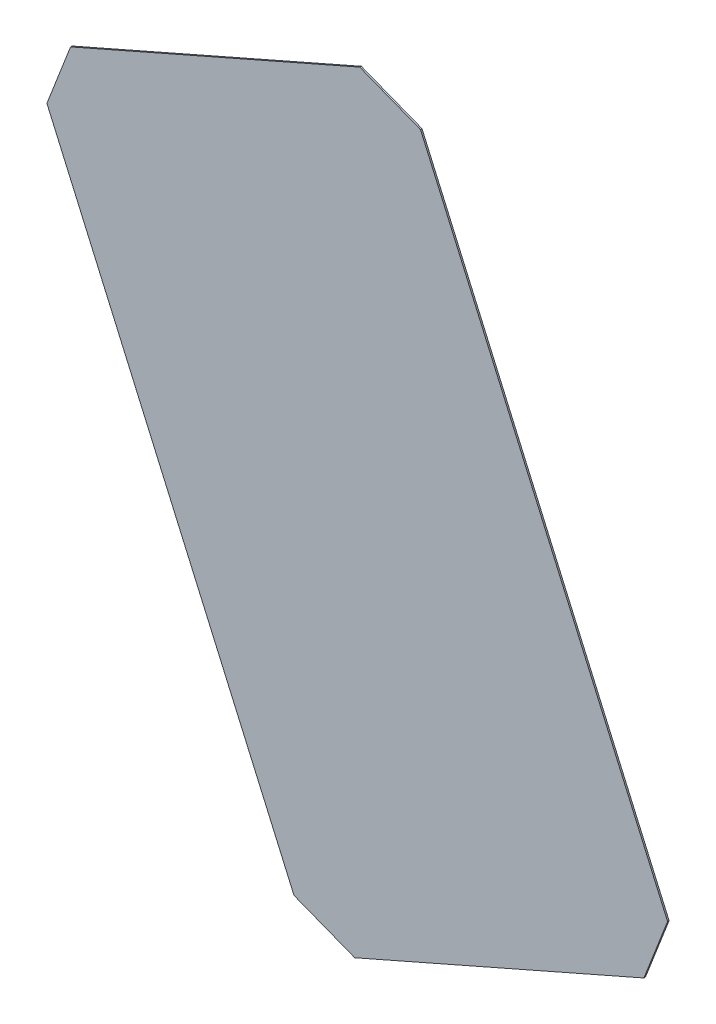
ISO-10303-21;
HEADER;
FILE_DESCRIPTION(('STEP AP214'),'2;1');
FILE_NAME('part.step','',(''),(''),'','','');
FILE_SCHEMA(('AUTOMOTIVE_DESIGN { 1 0 10303 214 1 1 1 1 }'));
ENDSEC;
DATA;
#1=APPLICATION_CONTEXT('core data for automotive mechanical design processes');
#2=APPLICATION_PROTOCOL_DEFINITION('international standard','automotive_design',2000,#1);
#3=PRODUCT_CONTEXT('',#1,'mechanical');
#4=PRODUCT('Part','Part','',(#3));
#5=PRODUCT_RELATED_PRODUCT_CATEGORY('part','',(#4));
#6=PRODUCT_DEFINITION_FORMATION('','',#4);
#7=PRODUCT_DEFINITION_CONTEXT('part definition',#1,'design');
#8=PRODUCT_DEFINITION('design','',#6,#7);
#9=PRODUCT_DEFINITION_SHAPE('','',#8);
#10=(LENGTH_UNIT() NAMED_UNIT(*) SI_UNIT(.MILLI.,.METRE.));
#11=(NAMED_UNIT(*) PLANE_ANGLE_UNIT() SI_UNIT($,.RADIAN.));
#12=(NAMED_UNIT(*) SI_UNIT($,.STERADIAN.) SOLID_ANGLE_UNIT());
#13=UNCERTAINTY_MEASURE_WITH_UNIT(LENGTH_MEASURE(1.E-05),#10,'distance_accuracy_value','');
#14=(GEOMETRIC_REPRESENTATION_CONTEXT(3) GLOBAL_UNCERTAINTY_ASSIGNED_CONTEXT((#13)) GLOBAL_UNIT_ASSIGNED_CONTEXT((#10,
#11,#12)) REPRESENTATION_CONTEXT('',''));
#15=CARTESIAN_POINT('',(0.,0.,0.));
#16=DIRECTION('',(0.,0.,1.));
#17=DIRECTION('',(1.,0.,0.));
#18=AXIS2_PLACEMENT_3D('',#15,#16,#17);
#19=CARTESIAN_POINT('',(-104.737676006849,451.856937350115,1.));
#20=DIRECTION('',(0.931814726160136,-0.362934313769187,0.));
#21=DIRECTION('',(0.362934313769187,0.931814726160136,0.));
#22=AXIS2_PLACEMENT_3D('',#19,#20,#21);
#23=PLANE('',#22);
#24=DIRECTION('',(-0.362934313769187,-0.931814726160136,0.));
#25=VECTOR('',#24,1.);
#26=CARTESIAN_POINT('',(-104.737676006849,451.856937350115,0.));
#27=LINE('',#26,#25);
#28=CARTESIAN_POINT('',(-89.33967714336,491.390488050754,0.));
#29=VERTEX_POINT('',#28);
#30=CARTESIAN_POINT('',(-104.737676006849,451.856937350115,0.));
#31=VERTEX_POINT('',#30);
#32=EDGE_CURVE('E133',#29,#31,#27,.T.);
#33=ORIENTED_EDGE('',*,*,#32,.T.);
#34=DIRECTION('',(0.,0.,-1.));
#35=VECTOR('',#34,1.);
#36=CARTESIAN_POINT('',(-104.737676006849,451.856937350115,1.));
#37=LINE('',#36,#35);
#38=CARTESIAN_POINT('',(-104.737676006849,451.856937350115,1.));
#39=VERTEX_POINT('',#38);
#40=EDGE_CURVE('E11',#39,#31,#37,.T.);
#41=ORIENTED_EDGE('',*,*,#40,.F.);
#42=DIRECTION('',(-0.362934313769187,-0.931814726160136,0.));
#43=VECTOR('',#42,1.);
#44=CARTESIAN_POINT('',(-104.737676006849,451.856937350115,1.));
#45=LINE('',#44,#43);
#46=CARTESIAN_POINT('',(-89.33967714336,491.390488050754,1.));
#47=VERTEX_POINT('',#46);
#48=EDGE_CURVE('E147',#47,#39,#45,.T.);
#49=ORIENTED_EDGE('',*,*,#48,.F.);
#50=DIRECTION('',(0.,0.,-1.));
#51=VECTOR('',#50,1.);
#52=CARTESIAN_POINT('',(-89.33967714336,491.390488050754,1.));
#53=LINE('',#52,#51);
#54=EDGE_CURVE('E129',#47,#29,#53,.T.);
#55=ORIENTED_EDGE('',*,*,#54,.T.);
#56=EDGE_LOOP('',(#33,#41,#49,#55));
#57=FACE_BOUND('',#56,.T.);
#58=ADVANCED_FACE('F37',(#57),#23,.F.);
#59=CARTESIAN_POINT('',(56.1660029074845,85.646606922595,1.));
#60=DIRECTION('',(0.915525826068799,0.402259197285833,0.));
#61=DIRECTION('',(-0.402259197285833,0.915525826068799,0.));
#62=AXIS2_PLACEMENT_3D('',#59,#60,#61);
#63=PLANE('',#62);
#64=DIRECTION('',(0.402259197285833,-0.915525826068799,0.));
#65=VECTOR('',#64,1.);
#66=CARTESIAN_POINT('',(56.1660029074845,85.646606922595,0.));
#67=LINE('',#66,#65);
#68=CARTESIAN_POINT('',(56.1660029074845,85.646606922595,0.));
#69=VERTEX_POINT('',#68);
#70=EDGE_CURVE('E136',#31,#69,#67,.T.);
#71=ORIENTED_EDGE('',*,*,#70,.T.);
#72=DIRECTION('',(0.,0.,-1.));
#73=VECTOR('',#72,1.);
#74=CARTESIAN_POINT('',(56.1660029074845,85.646606922595,1.));
#75=LINE('',#74,#73);
#76=CARTESIAN_POINT('',(56.1660029074845,85.646606922595,1.));
#77=VERTEX_POINT('',#76);
#78=EDGE_CURVE('E45',#77,#69,#75,.T.);
#79=ORIENTED_EDGE('',*,*,#78,.F.);
#80=DIRECTION('',(0.402259197285833,-0.915525826068799,0.));
#81=VECTOR('',#80,1.);
#82=CARTESIAN_POINT('',(56.1660029074845,85.646606922595,1.));
#83=LINE('',#82,#81);
#84=EDGE_CURVE('E96',#39,#77,#83,.T.);
#85=ORIENTED_EDGE('',*,*,#84,.F.);
#86=ORIENTED_EDGE('',*,*,#40,.T.);
#87=EDGE_LOOP('',(#71,#79,#85,#86));
#88=FACE_BOUND('',#87,.T.);
#89=ADVANCED_FACE('F182',(#88),#63,.F.);
#90=CARTESIAN_POINT('',(95.6995536081235,70.2486080591066,1.));
#91=DIRECTION('',(0.36293431376918,0.931814726160139,0.));
#92=DIRECTION('',(-0.931814726160139,0.36293431376918,0.));
#93=AXIS2_PLACEMENT_3D('',#90,#91,#92);
#94=PLANE('',#93);
#95=DIRECTION('',(0.931814726160139,-0.36293431376918,0.));
#96=VECTOR('',#95,1.);
#97=CARTESIAN_POINT('',(95.6995536081235,70.2486080591066,0.));
#98=LINE('',#97,#96);
#99=CARTESIAN_POINT('',(95.6995536081235,70.2486080591066,0.));
#100=VERTEX_POINT('',#99);
#101=EDGE_CURVE('E138',#69,#100,#98,.T.);
#102=ORIENTED_EDGE('',*,*,#101,.T.);
#103=DIRECTION('',(0.,0.,-1.));
#104=VECTOR('',#103,1.);
#105=CARTESIAN_POINT('',(95.6995536081235,70.2486080591066,1.));
#106=LINE('',#105,#104);
#107=CARTESIAN_POINT('',(95.6995536081235,70.2486080591066,1.));
#108=VERTEX_POINT('',#107);
#109=EDGE_CURVE('E154',#108,#100,#106,.T.);
#110=ORIENTED_EDGE('',*,*,#109,.F.);
#111=DIRECTION('',(0.931814726160139,-0.36293431376918,0.));
#112=VECTOR('',#111,1.);
#113=CARTESIAN_POINT('',(95.6995536081235,70.2486080591066,1.));
#114=LINE('',#113,#112);
#115=EDGE_CURVE('E162',#77,#108,#114,.T.);
#116=ORIENTED_EDGE('',*,*,#115,.F.);
#117=ORIENTED_EDGE('',*,*,#78,.T.);
#118=EDGE_LOOP('',(#102,#110,#116,#117));
#119=FACE_BOUND('',#118,.T.);
#120=ADVANCED_FACE('F160',(#119),#94,.F.);
#121=CARTESIAN_POINT('',(284.023216030475,152.993324940803,1.));
#122=DIRECTION('',(-0.402259197285834,0.915525826068799,0.));
#123=DIRECTION('',(-0.915525826068799,-0.402259197285834,0.));
#124=AXIS2_PLACEMENT_3D('',#121,#122,#123);
#125=PLANE('',#124);
#126=DIRECTION('',(0.915525826068799,0.402259197285834,0.));
#127=VECTOR('',#126,1.);
#128=CARTESIAN_POINT('',(284.023216030475,152.993324940803,0.));
#129=LINE('',#128,#127);
#130=CARTESIAN_POINT('',(284.023216030475,152.993324940803,0.));
#131=VERTEX_POINT('',#130);
#132=EDGE_CURVE('E140',#100,#131,#129,.T.);
#133=ORIENTED_EDGE('',*,*,#132,.T.);
#134=DIRECTION('',(0.,0.,-1.));
#135=VECTOR('',#134,1.);
#136=CARTESIAN_POINT('',(284.023216030475,152.993324940803,1.));
#137=LINE('',#136,#135);
#138=CARTESIAN_POINT('',(284.023216030475,152.993324940803,1.));
#139=VERTEX_POINT('',#138);
#140=EDGE_CURVE('E151',#139,#131,#137,.T.);
#141=ORIENTED_EDGE('',*,*,#140,.F.);
#142=DIRECTION('',(0.915525826068799,0.402259197285834,0.));
#143=VECTOR('',#142,1.);
#144=CARTESIAN_POINT('',(284.023216030475,152.993324940803,1.));
#145=LINE('',#144,#143);
#146=EDGE_CURVE('E174',#108,#139,#145,.T.);
#147=ORIENTED_EDGE('',*,*,#146,.F.);
#148=ORIENTED_EDGE('',*,*,#109,.T.);
#149=EDGE_LOOP('',(#133,#141,#147,#148));
#150=FACE_BOUND('',#149,.T.);
#151=ADVANCED_FACE('F170',(#150),#125,.F.);
#152=CARTESIAN_POINT('',(299.421214893964,192.526875641443,1.));
#153=DIRECTION('',(-0.931814726160137,0.362934313769186,0.));
#154=DIRECTION('',(-0.362934313769186,-0.931814726160136,0.));
#155=AXIS2_PLACEMENT_3D('',#152,#153,#154);
#156=PLANE('',#155);
#157=DIRECTION('',(0.362934313769186,0.931814726160136,0.));
#158=VECTOR('',#157,1.);
#159=CARTESIAN_POINT('',(299.421214893964,192.526875641443,0.));
#160=LINE('',#159,#158);
#161=CARTESIAN_POINT('',(299.421214893964,192.526875641443,0.));
#162=VERTEX_POINT('',#161);
#163=EDGE_CURVE('E142',#131,#162,#160,.T.);
#164=ORIENTED_EDGE('',*,*,#163,.T.);
#165=DIRECTION('',(0.,0.,-1.));
#166=VECTOR('',#165,1.);
#167=CARTESIAN_POINT('',(299.421214893964,192.526875641443,1.));
#168=LINE('',#167,#166);
#169=CARTESIAN_POINT('',(299.421214893964,192.526875641443,1.));
#170=VERTEX_POINT('',#169);
#171=EDGE_CURVE('E124',#170,#162,#168,.T.);
#172=ORIENTED_EDGE('',*,*,#171,.F.);
#173=DIRECTION('',(0.362934313769186,0.931814726160136,0.));
#174=VECTOR('',#173,1.);
#175=CARTESIAN_POINT('',(299.421214893964,192.526875641443,1.));
#176=LINE('',#175,#174);
#177=EDGE_CURVE('E115',#139,#170,#176,.T.);
#178=ORIENTED_EDGE('',*,*,#177,.F.);
#179=ORIENTED_EDGE('',*,*,#140,.T.);
#180=EDGE_LOOP('',(#164,#172,#178,#179));
#181=FACE_BOUND('',#180,.T.);
#182=ADVANCED_FACE('F173',(#181),#156,.F.);
#183=CARTESIAN_POINT('',(138.517535979631,558.737206068961,1.));
#184=DIRECTION('',(-0.915525826068799,-0.402259197285834,0.));
#185=DIRECTION('',(0.402259197285834,-0.915525826068799,0.));
#186=AXIS2_PLACEMENT_3D('',#183,#184,#185);
#187=PLANE('',#186);
#188=DIRECTION('',(-0.402259197285834,0.915525826068799,0.));
#189=VECTOR('',#188,1.);
#190=CARTESIAN_POINT('',(138.517535979631,558.737206068961,0.));
#191=LINE('',#190,#189);
#192=CARTESIAN_POINT('',(138.517535979631,558.737206068961,0.));
#193=VERTEX_POINT('',#192);
#194=EDGE_CURVE('E123',#162,#193,#191,.T.);
#195=ORIENTED_EDGE('',*,*,#194,.T.);
#196=DIRECTION('',(0.,0.,-1.));
#197=VECTOR('',#196,1.);
#198=CARTESIAN_POINT('',(138.517535979631,558.737206068961,1.));
#199=LINE('',#198,#197);
#200=CARTESIAN_POINT('',(138.517535979631,558.737206068961,1.));
#201=VERTEX_POINT('',#200);
#202=EDGE_CURVE('E120',#201,#193,#199,.T.);
#203=ORIENTED_EDGE('',*,*,#202,.F.);
#204=DIRECTION('',(-0.402259197285834,0.915525826068799,0.));
#205=VECTOR('',#204,1.);
#206=CARTESIAN_POINT('',(138.517535979631,558.737206068961,1.));
#207=LINE('',#206,#205);
#208=EDGE_CURVE('E109',#170,#201,#207,.T.);
#209=ORIENTED_EDGE('',*,*,#208,.F.);
#210=ORIENTED_EDGE('',*,*,#171,.T.);
#211=EDGE_LOOP('',(#195,#203,#209,#210));
#212=FACE_BOUND('',#211,.T.);
#213=ADVANCED_FACE('F121',(#212),#187,.F.);
#214=CARTESIAN_POINT('',(98.9839852789918,574.13520493245,1.));
#215=DIRECTION('',(-0.362934313769187,-0.931814726160136,0.));
#216=DIRECTION('',(0.931814726160136,-0.362934313769187,0.));
#217=AXIS2_PLACEMENT_3D('',#214,#215,#216);
#218=PLANE('',#217);
#219=DIRECTION('',(-0.931814726160136,0.362934313769187,0.));
#220=VECTOR('',#219,1.);
#221=CARTESIAN_POINT('',(98.9839852789918,574.13520493245,0.));
#222=LINE('',#221,#220);
#223=CARTESIAN_POINT('',(98.9839852789918,574.13520493245,0.));
#224=VERTEX_POINT('',#223);
#225=EDGE_CURVE('E82',#193,#224,#222,.T.);
#226=ORIENTED_EDGE('',*,*,#225,.T.);
#227=DIRECTION('',(0.,0.,-1.));
#228=VECTOR('',#227,1.);
#229=CARTESIAN_POINT('',(98.9839852789918,574.13520493245,1.));
#230=LINE('',#229,#228);
#231=CARTESIAN_POINT('',(98.9839852789918,574.13520493245,1.));
#232=VERTEX_POINT('',#231);
#233=EDGE_CURVE('E125',#232,#224,#230,.T.);
#234=ORIENTED_EDGE('',*,*,#233,.F.);
#235=DIRECTION('',(-0.931814726160136,0.362934313769187,0.));
#236=VECTOR('',#235,1.);
#237=CARTESIAN_POINT('',(98.9839852789918,574.13520493245,1.));
#238=LINE('',#237,#236);
#239=EDGE_CURVE('E113',#201,#232,#238,.T.);
#240=ORIENTED_EDGE('',*,*,#239,.F.);
#241=ORIENTED_EDGE('',*,*,#202,.T.);
#242=EDGE_LOOP('',(#226,#234,#240,#241));
#243=FACE_BOUND('',#242,.T.);
#244=ADVANCED_FACE('F127',(#243),#218,.F.);
#245=CARTESIAN_POINT('',(-89.33967714336,491.390488050754,1.));
#246=DIRECTION('',(0.402259197285834,-0.915525826068799,0.));
#247=DIRECTION('',(0.915525826068799,0.402259197285834,0.));
#248=AXIS2_PLACEMENT_3D('',#245,#246,#247);
#249=PLANE('',#248);
#250=DIRECTION('',(-0.915525826068799,-0.402259197285834,0.));
#251=VECTOR('',#250,1.);
#252=CARTESIAN_POINT('',(-89.33967714336,491.390488050754,0.));
#253=LINE('',#252,#251);
#254=EDGE_CURVE('E88',#224,#29,#253,.T.);
#255=ORIENTED_EDGE('',*,*,#254,.T.);
#256=ORIENTED_EDGE('',*,*,#54,.F.);
#257=DIRECTION('',(-0.915525826068799,-0.402259197285834,0.));
#258=VECTOR('',#257,1.);
#259=CARTESIAN_POINT('',(-89.33967714336,491.390488050754,1.));
#260=LINE('',#259,#258);
#261=EDGE_CURVE('E53',#232,#47,#260,.T.);
#262=ORIENTED_EDGE('',*,*,#261,.F.);
#263=ORIENTED_EDGE('',*,*,#233,.T.);
#264=EDGE_LOOP('',(#255,#256,#262,#263));
#265=FACE_BOUND('',#264,.T.);
#266=ADVANCED_FACE('F198',(#265),#249,.F.);
#267=CARTESIAN_POINT('',(0.,0.,1.));
#268=DIRECTION('',(0.,0.,-1.));
#269=DIRECTION('',(-1.,0.,0.));
#270=AXIS2_PLACEMENT_3D('',#267,#268,#269);
#271=PLANE('',#270);
#272=ORIENTED_EDGE('',*,*,#48,.T.);
#273=ORIENTED_EDGE('',*,*,#84,.T.);
#274=ORIENTED_EDGE('',*,*,#115,.T.);
#275=ORIENTED_EDGE('',*,*,#146,.T.);
#276=ORIENTED_EDGE('',*,*,#177,.T.);
#277=ORIENTED_EDGE('',*,*,#208,.T.);
#278=ORIENTED_EDGE('',*,*,#239,.T.);
#279=ORIENTED_EDGE('',*,*,#261,.T.);
#280=EDGE_LOOP('',(#272,#273,#274,#275,#276,#277,#278,#279));
#281=FACE_BOUND('',#280,.T.);
#282=ADVANCED_FACE('F111',(#281),#271,.F.);
#283=CARTESIAN_POINT('',(0.,0.,0.));
#284=DIRECTION('',(0.,0.,-1.));
#285=DIRECTION('',(-1.,0.,0.));
#286=AXIS2_PLACEMENT_3D('',#283,#284,#285);
#287=PLANE('',#286);
#288=ORIENTED_EDGE('',*,*,#32,.F.);
#289=ORIENTED_EDGE('',*,*,#254,.F.);
#290=ORIENTED_EDGE('',*,*,#225,.F.);
#291=ORIENTED_EDGE('',*,*,#194,.F.);
#292=ORIENTED_EDGE('',*,*,#163,.F.);
#293=ORIENTED_EDGE('',*,*,#132,.F.);
#294=ORIENTED_EDGE('',*,*,#101,.F.);
#295=ORIENTED_EDGE('',*,*,#70,.F.);
#296=EDGE_LOOP('',(#288,#289,#290,#291,#292,#293,#294,#295));
#297=FACE_BOUND('',#296,.T.);
#298=ADVANCED_FACE('F166',(#297),#287,.T.);
#299=CLOSED_SHELL('',(#58,#89,#120,#151,#182,#213,#244,#266,#282,#298));
#300=MANIFOLD_SOLID_BREP('B2',#299);
#301=ADVANCED_BREP_SHAPE_REPRESENTATION('',(#18,#300),#14);
#302=SHAPE_DEFINITION_REPRESENTATION(#9,#301);
ENDSEC;
END-ISO-10303-21;
